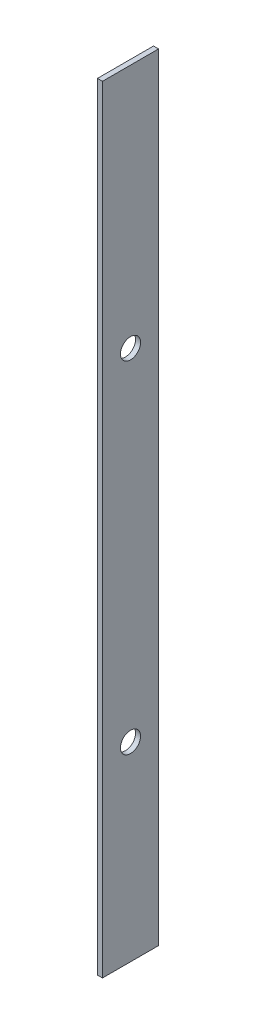
ISO-10303-21;
HEADER;
FILE_DESCRIPTION(('STEP AP214'),'2;1');
FILE_NAME('part.step','',(''),(''),'','','');
FILE_SCHEMA(('AUTOMOTIVE_DESIGN { 1 0 10303 214 1 1 1 1 }'));
ENDSEC;
DATA;
#1=APPLICATION_CONTEXT('core data for automotive mechanical design processes');
#2=APPLICATION_PROTOCOL_DEFINITION('international standard','automotive_design',2000,#1);
#3=PRODUCT_CONTEXT('',#1,'mechanical');
#4=PRODUCT('Part','Part','',(#3));
#5=PRODUCT_RELATED_PRODUCT_CATEGORY('part','',(#4));
#6=PRODUCT_DEFINITION_FORMATION('','',#4);
#7=PRODUCT_DEFINITION_CONTEXT('part definition',#1,'design');
#8=PRODUCT_DEFINITION('design','',#6,#7);
#9=PRODUCT_DEFINITION_SHAPE('','',#8);
#10=(LENGTH_UNIT() NAMED_UNIT(*) SI_UNIT(.MILLI.,.METRE.));
#11=(NAMED_UNIT(*) PLANE_ANGLE_UNIT() SI_UNIT($,.RADIAN.));
#12=(NAMED_UNIT(*) SI_UNIT($,.STERADIAN.) SOLID_ANGLE_UNIT());
#13=UNCERTAINTY_MEASURE_WITH_UNIT(LENGTH_MEASURE(1.E-05),#10,'distance_accuracy_value','');
#14=(GEOMETRIC_REPRESENTATION_CONTEXT(3) GLOBAL_UNCERTAINTY_ASSIGNED_CONTEXT((#13)) GLOBAL_UNIT_ASSIGNED_CONTEXT((#10,
#11,#12)) REPRESENTATION_CONTEXT('',''));
#15=CARTESIAN_POINT('',(0.,0.,0.));
#16=DIRECTION('',(0.,0.,1.));
#17=DIRECTION('',(1.,0.,0.));
#18=AXIS2_PLACEMENT_3D('',#15,#16,#17);
#19=CARTESIAN_POINT('',(1.5,0.,0.));
#20=DIRECTION('',(1.,0.,0.));
#21=DIRECTION('',(0.,0.,-1.));
#22=AXIS2_PLACEMENT_3D('',#19,#20,#21);
#23=PLANE('',#22);
#24=CARTESIAN_POINT('',(1.5,150.357641891011,326.786752094627));
#25=DIRECTION('',(1.,0.,0.));
#26=DIRECTION('',(0.,0.,-1.));
#27=AXIS2_PLACEMENT_3D('',#24,#25,#26);
#28=CIRCLE('',#27,2.99999999999999);
#29=CARTESIAN_POINT('',(1.5,150.357641891011,323.786752094627));
#30=VERTEX_POINT('',#29);
#31=EDGE_CURVE('E110',#30,#30,#28,.T.);
#32=ORIENTED_EDGE('',*,*,#31,.F.);
#33=EDGE_LOOP('',(#32));
#34=FACE_BOUND('',#33,.T.);
#35=DIRECTION('',(0.,-1.,0.));
#36=VECTOR('',#35,1.);
#37=CARTESIAN_POINT('',(1.5,223.430241891008,335.143752094618));
#38=LINE('',#37,#36);
#39=CARTESIAN_POINT('',(1.5,223.430241891008,335.143752094618));
#40=VERTEX_POINT('',#39);
#41=CARTESIAN_POINT('',(1.5,-7.99085135780629,335.143752094618));
#42=VERTEX_POINT('',#41);
#43=EDGE_CURVE('E103',#40,#42,#38,.T.);
#44=ORIENTED_EDGE('',*,*,#43,.T.);
#45=DIRECTION('',(0.,0.,-1.));
#46=VECTOR('',#45,1.);
#47=CARTESIAN_POINT('',(1.5,-7.99085135780629,335.143752094618));
#48=LINE('',#47,#46);
#49=CARTESIAN_POINT('',(1.5,-7.99085135780629,318.429752094618));
#50=VERTEX_POINT('',#49);
#51=EDGE_CURVE('E72',#42,#50,#48,.T.);
#52=ORIENTED_EDGE('',*,*,#51,.T.);
#53=DIRECTION('',(0.,1.,0.));
#54=VECTOR('',#53,1.);
#55=CARTESIAN_POINT('',(1.5,-7.99085135780629,318.429752094618));
#56=LINE('',#55,#54);
#57=CARTESIAN_POINT('',(1.5,223.430241891008,318.429752094618));
#58=VERTEX_POINT('',#57);
#59=EDGE_CURVE('E112',#50,#58,#56,.T.);
#60=ORIENTED_EDGE('',*,*,#59,.T.);
#61=DIRECTION('',(0.,0.,1.));
#62=VECTOR('',#61,1.);
#63=CARTESIAN_POINT('',(1.5,223.430241891008,318.429752094618));
#64=LINE('',#63,#62);
#65=EDGE_CURVE('E96',#58,#40,#64,.T.);
#66=ORIENTED_EDGE('',*,*,#65,.T.);
#67=EDGE_LOOP('',(#44,#52,#60,#66));
#68=FACE_BOUND('',#67,.T.);
#69=CARTESIAN_POINT('',(1.5,48.7576418910106,326.78675209462));
#70=DIRECTION('',(1.,0.,0.));
#71=DIRECTION('',(0.,0.,-1.));
#72=AXIS2_PLACEMENT_3D('',#69,#70,#71);
#73=CIRCLE('',#72,2.99999999999999);
#74=CARTESIAN_POINT('',(1.5,48.7576418910106,323.78675209462));
#75=VERTEX_POINT('',#74);
#76=EDGE_CURVE('E43',#75,#75,#73,.T.);
#77=ORIENTED_EDGE('',*,*,#76,.F.);
#78=EDGE_LOOP('',(#77));
#79=FACE_BOUND('',#78,.T.);
#80=ADVANCED_FACE('F39',(#34,#68,#79),#23,.T.);
#81=CARTESIAN_POINT('',(0.,0.,0.));
#82=DIRECTION('',(1.,0.,0.));
#83=DIRECTION('',(0.,0.,-1.));
#84=AXIS2_PLACEMENT_3D('',#81,#82,#83);
#85=PLANE('',#84);
#86=DIRECTION('',(0.,-1.,0.));
#87=VECTOR('',#86,1.);
#88=CARTESIAN_POINT('',(0.,223.430241891008,335.143752094618));
#89=LINE('',#88,#87);
#90=CARTESIAN_POINT('',(0.,223.430241891008,335.143752094618));
#91=VERTEX_POINT('',#90);
#92=CARTESIAN_POINT('',(0.,-7.99085135780629,335.143752094618));
#93=VERTEX_POINT('',#92);
#94=EDGE_CURVE('E102',#91,#93,#89,.T.);
#95=ORIENTED_EDGE('',*,*,#94,.F.);
#96=DIRECTION('',(0.,0.,1.));
#97=VECTOR('',#96,1.);
#98=CARTESIAN_POINT('',(0.,223.430241891008,318.429752094618));
#99=LINE('',#98,#97);
#100=CARTESIAN_POINT('',(0.,223.430241891008,318.429752094618));
#101=VERTEX_POINT('',#100);
#102=EDGE_CURVE('E82',#101,#91,#99,.T.);
#103=ORIENTED_EDGE('',*,*,#102,.F.);
#104=DIRECTION('',(0.,1.,0.));
#105=VECTOR('',#104,1.);
#106=CARTESIAN_POINT('',(0.,-7.99085135780629,318.429752094618));
#107=LINE('',#106,#105);
#108=CARTESIAN_POINT('',(0.,-7.99085135780629,318.429752094618));
#109=VERTEX_POINT('',#108);
#110=EDGE_CURVE('E88',#109,#101,#107,.T.);
#111=ORIENTED_EDGE('',*,*,#110,.F.);
#112=DIRECTION('',(0.,0.,-1.));
#113=VECTOR('',#112,1.);
#114=CARTESIAN_POINT('',(0.,-7.99085135780629,335.143752094618));
#115=LINE('',#114,#113);
#116=EDGE_CURVE('E56',#93,#109,#115,.T.);
#117=ORIENTED_EDGE('',*,*,#116,.F.);
#118=EDGE_LOOP('',(#95,#103,#111,#117));
#119=FACE_BOUND('',#118,.T.);
#120=CARTESIAN_POINT('',(0.,150.357641891011,326.786752094627));
#121=DIRECTION('',(1.,0.,0.));
#122=DIRECTION('',(0.,0.,-1.));
#123=AXIS2_PLACEMENT_3D('',#120,#121,#122);
#124=CIRCLE('',#123,2.99999999999999);
#125=CARTESIAN_POINT('',(0.,150.357641891011,323.786752094627));
#126=VERTEX_POINT('',#125);
#127=EDGE_CURVE('E115',#126,#126,#124,.T.);
#128=ORIENTED_EDGE('',*,*,#127,.T.);
#129=EDGE_LOOP('',(#128));
#130=FACE_BOUND('',#129,.T.);
#131=CARTESIAN_POINT('',(0.,48.7576418910106,326.78675209462));
#132=DIRECTION('',(1.,0.,0.));
#133=DIRECTION('',(0.,0.,-1.));
#134=AXIS2_PLACEMENT_3D('',#131,#132,#133);
#135=CIRCLE('',#134,2.99999999999999);
#136=CARTESIAN_POINT('',(0.,48.7576418910106,323.78675209462));
#137=VERTEX_POINT('',#136);
#138=EDGE_CURVE('E11',#137,#137,#135,.T.);
#139=ORIENTED_EDGE('',*,*,#138,.T.);
#140=EDGE_LOOP('',(#139));
#141=FACE_BOUND('',#140,.T.);
#142=ADVANCED_FACE('F99',(#119,#130,#141),#85,.F.);
#143=CARTESIAN_POINT('',(1.5,223.430241891008,335.143752094618));
#144=DIRECTION('',(0.,0.,-1.));
#145=DIRECTION('',(-1.,0.,0.));
#146=AXIS2_PLACEMENT_3D('',#143,#144,#145);
#147=PLANE('',#146);
#148=ORIENTED_EDGE('',*,*,#94,.T.);
#149=DIRECTION('',(-1.,0.,0.));
#150=VECTOR('',#149,1.);
#151=CARTESIAN_POINT('',(1.5,-7.99085135780629,335.143752094618));
#152=LINE('',#151,#150);
#153=EDGE_CURVE('E165',#42,#93,#152,.T.);
#154=ORIENTED_EDGE('',*,*,#153,.F.);
#155=ORIENTED_EDGE('',*,*,#43,.F.);
#156=DIRECTION('',(-1.,0.,0.));
#157=VECTOR('',#156,1.);
#158=CARTESIAN_POINT('',(1.5,223.430241891008,335.143752094618));
#159=LINE('',#158,#157);
#160=EDGE_CURVE('E97',#40,#91,#159,.T.);
#161=ORIENTED_EDGE('',*,*,#160,.T.);
#162=EDGE_LOOP('',(#148,#154,#155,#161));
#163=FACE_BOUND('',#162,.T.);
#164=ADVANCED_FACE('F137',(#163),#147,.F.);
#165=CARTESIAN_POINT('',(1.5,-7.99085135780629,335.143752094618));
#166=DIRECTION('',(0.,1.,0.));
#167=DIRECTION('',(0.,0.,1.));
#168=AXIS2_PLACEMENT_3D('',#165,#166,#167);
#169=PLANE('',#168);
#170=ORIENTED_EDGE('',*,*,#116,.T.);
#171=DIRECTION('',(-1.,0.,0.));
#172=VECTOR('',#171,1.);
#173=CARTESIAN_POINT('',(1.5,-7.99085135780629,318.429752094618));
#174=LINE('',#173,#172);
#175=EDGE_CURVE('E93',#50,#109,#174,.T.);
#176=ORIENTED_EDGE('',*,*,#175,.F.);
#177=ORIENTED_EDGE('',*,*,#51,.F.);
#178=ORIENTED_EDGE('',*,*,#153,.T.);
#179=EDGE_LOOP('',(#170,#176,#177,#178));
#180=FACE_BOUND('',#179,.T.);
#181=ADVANCED_FACE('F143',(#180),#169,.F.);
#182=CARTESIAN_POINT('',(1.5,-7.99085135780629,318.429752094618));
#183=DIRECTION('',(0.,0.,1.));
#184=DIRECTION('',(1.,0.,0.));
#185=AXIS2_PLACEMENT_3D('',#182,#183,#184);
#186=PLANE('',#185);
#187=ORIENTED_EDGE('',*,*,#110,.T.);
#188=DIRECTION('',(-1.,0.,0.));
#189=VECTOR('',#188,1.);
#190=CARTESIAN_POINT('',(1.5,223.430241891008,318.429752094618));
#191=LINE('',#190,#189);
#192=EDGE_CURVE('E91',#58,#101,#191,.T.);
#193=ORIENTED_EDGE('',*,*,#192,.F.);
#194=ORIENTED_EDGE('',*,*,#59,.F.);
#195=ORIENTED_EDGE('',*,*,#175,.T.);
#196=EDGE_LOOP('',(#187,#193,#194,#195));
#197=FACE_BOUND('',#196,.T.);
#198=ADVANCED_FACE('F89',(#197),#186,.F.);
#199=CARTESIAN_POINT('',(1.5,223.430241891008,318.429752094618));
#200=DIRECTION('',(0.,-1.,0.));
#201=DIRECTION('',(0.,0.,-1.));
#202=AXIS2_PLACEMENT_3D('',#199,#200,#201);
#203=PLANE('',#202);
#204=ORIENTED_EDGE('',*,*,#102,.T.);
#205=ORIENTED_EDGE('',*,*,#160,.F.);
#206=ORIENTED_EDGE('',*,*,#65,.F.);
#207=ORIENTED_EDGE('',*,*,#192,.T.);
#208=EDGE_LOOP('',(#204,#205,#206,#207));
#209=FACE_BOUND('',#208,.T.);
#210=ADVANCED_FACE('F95',(#209),#203,.F.);
#211=CARTESIAN_POINT('',(1.5,150.357641891011,326.786752094627));
#212=DIRECTION('',(-1.,0.,0.));
#213=DIRECTION('',(0.,0.,1.));
#214=AXIS2_PLACEMENT_3D('',#211,#212,#213);
#215=CYLINDRICAL_SURFACE('',#214,2.99999999999999);
#216=ORIENTED_EDGE('',*,*,#31,.T.);
#217=EDGE_LOOP('',(#216));
#218=FACE_BOUND('',#217,.T.);
#219=ORIENTED_EDGE('',*,*,#127,.F.);
#220=EDGE_LOOP('',(#219));
#221=FACE_BOUND('',#220,.T.);
#222=ADVANCED_FACE('F121',(#218,#221),#215,.F.);
#223=CARTESIAN_POINT('',(1.5,48.7576418910106,326.78675209462));
#224=DIRECTION('',(-1.,0.,0.));
#225=DIRECTION('',(0.,0.,1.));
#226=AXIS2_PLACEMENT_3D('',#223,#224,#225);
#227=CYLINDRICAL_SURFACE('',#226,2.99999999999999);
#228=ORIENTED_EDGE('',*,*,#76,.T.);
#229=EDGE_LOOP('',(#228));
#230=FACE_BOUND('',#229,.T.);
#231=ORIENTED_EDGE('',*,*,#138,.F.);
#232=EDGE_LOOP('',(#231));
#233=FACE_BOUND('',#232,.T.);
#234=ADVANCED_FACE('F41',(#230,#233),#227,.F.);
#235=CLOSED_SHELL('',(#80,#142,#164,#181,#198,#210,#222,#234));
#236=MANIFOLD_SOLID_BREP('B2',#235);
#237=ADVANCED_BREP_SHAPE_REPRESENTATION('',(#18,#236),#14);
#238=SHAPE_DEFINITION_REPRESENTATION(#9,#237);
ENDSEC;
END-ISO-10303-21;
